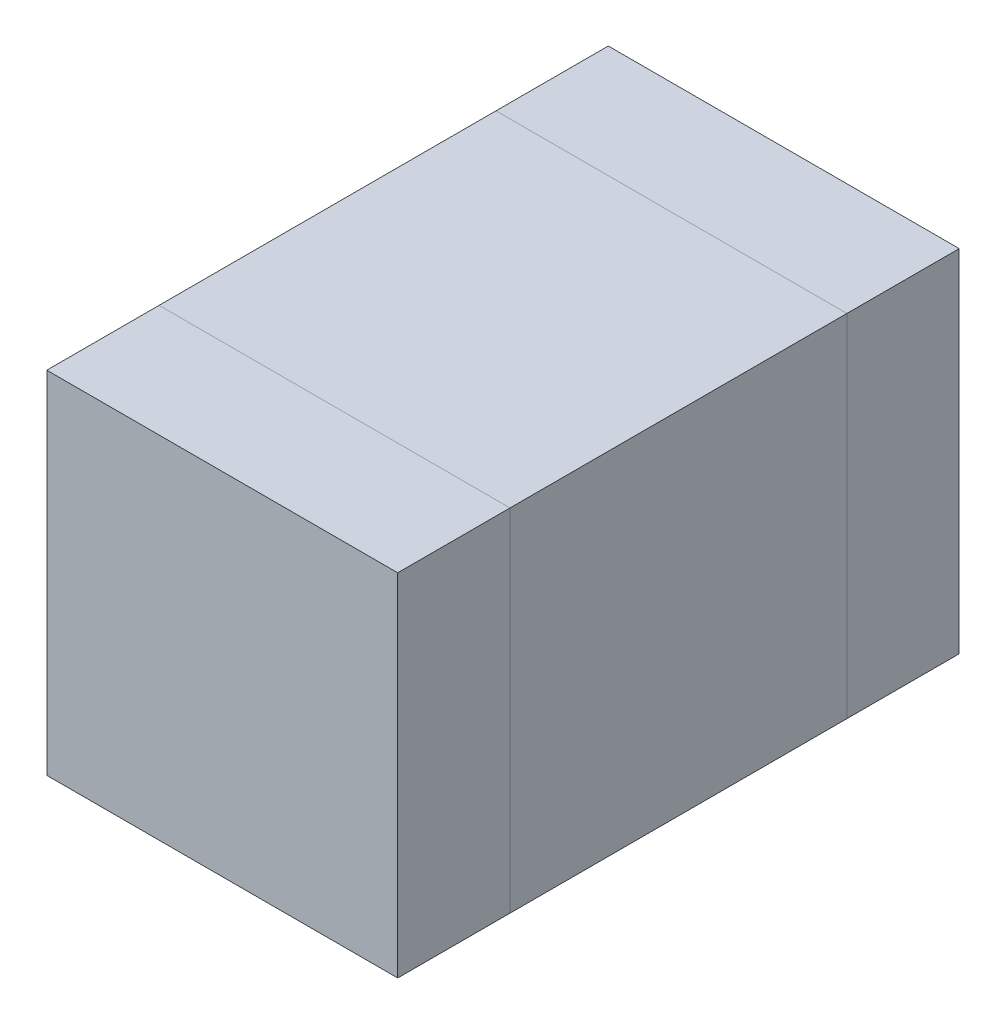
ISO-10303-21;
HEADER;
FILE_DESCRIPTION(('STEP AP214'),'2;1');
FILE_NAME('part.step','',(''),(''),'','','');
FILE_SCHEMA(('AUTOMOTIVE_DESIGN { 1 0 10303 214 1 1 1 1 }'));
ENDSEC;
DATA;
#1=APPLICATION_CONTEXT('core data for automotive mechanical design processes');
#2=APPLICATION_PROTOCOL_DEFINITION('international standard','automotive_design',2000,#1);
#3=PRODUCT_CONTEXT('',#1,'mechanical');
#4=PRODUCT('Part','Part','',(#3));
#5=PRODUCT_RELATED_PRODUCT_CATEGORY('part','',(#4));
#6=PRODUCT_DEFINITION_FORMATION('','',#4);
#7=PRODUCT_DEFINITION_CONTEXT('part definition',#1,'design');
#8=PRODUCT_DEFINITION('design','',#6,#7);
#9=PRODUCT_DEFINITION_SHAPE('','',#8);
#10=(LENGTH_UNIT() NAMED_UNIT(*) SI_UNIT(.MILLI.,.METRE.));
#11=(NAMED_UNIT(*) PLANE_ANGLE_UNIT() SI_UNIT($,.RADIAN.));
#12=(NAMED_UNIT(*) SI_UNIT($,.STERADIAN.) SOLID_ANGLE_UNIT());
#13=UNCERTAINTY_MEASURE_WITH_UNIT(LENGTH_MEASURE(1.E-05),#10,'distance_accuracy_value','');
#14=(GEOMETRIC_REPRESENTATION_CONTEXT(3) GLOBAL_UNCERTAINTY_ASSIGNED_CONTEXT((#13)) GLOBAL_UNIT_ASSIGNED_CONTEXT((#10,
#11,#12)) REPRESENTATION_CONTEXT('',''));
#15=CARTESIAN_POINT('',(0.,0.,0.));
#16=DIRECTION('',(0.,0.,1.));
#17=DIRECTION('',(1.,0.,0.));
#18=AXIS2_PLACEMENT_3D('',#15,#16,#17);
#19=CARTESIAN_POINT('',(0.,1.25,0.));
#20=DIRECTION('',(0.,1.,0.));
#21=DIRECTION('',(0.,0.,1.));
#22=AXIS2_PLACEMENT_3D('',#19,#20,#21);
#23=PLANE('',#22);
#24=DIRECTION('',(0.,0.,-1.));
#25=VECTOR('',#24,1.);
#26=CARTESIAN_POINT('',(-0.625,1.25,-0.6));
#27=LINE('',#26,#25);
#28=CARTESIAN_POINT('',(-0.625,1.25,-0.6));
#29=VERTEX_POINT('',#28);
#30=CARTESIAN_POINT('',(-0.625,1.25,-1.));
#31=VERTEX_POINT('',#30);
#32=EDGE_CURVE('E51',#29,#31,#27,.T.);
#33=ORIENTED_EDGE('',*,*,#32,.F.);
#34=DIRECTION('',(-1.,0.,0.));
#35=VECTOR('',#34,1.);
#36=CARTESIAN_POINT('',(-0.625,1.25,-0.6));
#37=LINE('',#36,#35);
#38=CARTESIAN_POINT('',(0.625,1.25,-0.6));
#39=VERTEX_POINT('',#38);
#40=EDGE_CURVE('E74',#39,#29,#37,.T.);
#41=ORIENTED_EDGE('',*,*,#40,.F.);
#42=DIRECTION('',(0.,0.,1.));
#43=VECTOR('',#42,1.);
#44=CARTESIAN_POINT('',(0.625,1.25,-0.6));
#45=LINE('',#44,#43);
#46=CARTESIAN_POINT('',(0.625,1.25,-1.));
#47=VERTEX_POINT('',#46);
#48=EDGE_CURVE('E79',#47,#39,#45,.T.);
#49=ORIENTED_EDGE('',*,*,#48,.F.);
#50=DIRECTION('',(1.,0.,0.));
#51=VECTOR('',#50,1.);
#52=CARTESIAN_POINT('',(-0.625,1.25,-1.));
#53=LINE('',#52,#51);
#54=EDGE_CURVE('E94',#31,#47,#53,.T.);
#55=ORIENTED_EDGE('',*,*,#54,.F.);
#56=EDGE_LOOP('',(#33,#41,#49,#55));
#57=FACE_BOUND('',#56,.T.);
#58=ADVANCED_FACE('F43',(#57),#23,.T.);
#59=CARTESIAN_POINT('',(0.,0.,0.));
#60=DIRECTION('',(0.,-1.,0.));
#61=DIRECTION('',(0.,0.,-1.));
#62=AXIS2_PLACEMENT_3D('',#59,#60,#61);
#63=PLANE('',#62);
#64=DIRECTION('',(0.,0.,-1.));
#65=VECTOR('',#64,1.);
#66=CARTESIAN_POINT('',(-0.625,0.,-0.6));
#67=LINE('',#66,#65);
#68=CARTESIAN_POINT('',(-0.625,0.,-0.6));
#69=VERTEX_POINT('',#68);
#70=CARTESIAN_POINT('',(-0.625,0.,-1.));
#71=VERTEX_POINT('',#70);
#72=EDGE_CURVE('E103',#69,#71,#67,.T.);
#73=ORIENTED_EDGE('',*,*,#72,.T.);
#74=DIRECTION('',(1.,0.,0.));
#75=VECTOR('',#74,1.);
#76=CARTESIAN_POINT('',(-0.625,0.,-1.));
#77=LINE('',#76,#75);
#78=CARTESIAN_POINT('',(0.625,0.,-1.));
#79=VERTEX_POINT('',#78);
#80=EDGE_CURVE('E92',#71,#79,#77,.T.);
#81=ORIENTED_EDGE('',*,*,#80,.T.);
#82=DIRECTION('',(0.,0.,1.));
#83=VECTOR('',#82,1.);
#84=CARTESIAN_POINT('',(0.625,0.,-0.6));
#85=LINE('',#84,#83);
#86=CARTESIAN_POINT('',(0.625,0.,-0.6));
#87=VERTEX_POINT('',#86);
#88=EDGE_CURVE('E95',#79,#87,#85,.T.);
#89=ORIENTED_EDGE('',*,*,#88,.T.);
#90=DIRECTION('',(-1.,0.,0.));
#91=VECTOR('',#90,1.);
#92=CARTESIAN_POINT('',(-0.625,0.,-0.6));
#93=LINE('',#92,#91);
#94=EDGE_CURVE('E100',#87,#69,#93,.T.);
#95=ORIENTED_EDGE('',*,*,#94,.T.);
#96=EDGE_LOOP('',(#73,#81,#89,#95));
#97=FACE_BOUND('',#96,.T.);
#98=ADVANCED_FACE('F102',(#97),#63,.T.);
#99=CARTESIAN_POINT('',(-0.625,2.56244047484067,-1.));
#100=DIRECTION('',(0.,0.,-1.));
#101=DIRECTION('',(-1.,0.,0.));
#102=AXIS2_PLACEMENT_3D('',#99,#100,#101);
#103=PLANE('',#102);
#104=DIRECTION('',(0.,-1.,0.));
#105=VECTOR('',#104,1.);
#106=CARTESIAN_POINT('',(-0.625,2.56244047484067,-1.));
#107=LINE('',#106,#105);
#108=EDGE_CURVE('E12',#31,#71,#107,.T.);
#109=ORIENTED_EDGE('',*,*,#108,.F.);
#110=ORIENTED_EDGE('',*,*,#54,.T.);
#111=DIRECTION('',(0.,-1.,0.));
#112=VECTOR('',#111,1.);
#113=CARTESIAN_POINT('',(0.625,2.56244047484067,-1.));
#114=LINE('',#113,#112);
#115=EDGE_CURVE('E89',#47,#79,#114,.T.);
#116=ORIENTED_EDGE('',*,*,#115,.T.);
#117=ORIENTED_EDGE('',*,*,#80,.F.);
#118=EDGE_LOOP('',(#109,#110,#116,#117));
#119=FACE_BOUND('',#118,.T.);
#120=ADVANCED_FACE('F90',(#119),#103,.T.);
#121=CARTESIAN_POINT('',(0.625,2.56244047484067,-0.6));
#122=DIRECTION('',(1.,0.,0.));
#123=DIRECTION('',(0.,0.,-1.));
#124=AXIS2_PLACEMENT_3D('',#121,#122,#123);
#125=PLANE('',#124);
#126=ORIENTED_EDGE('',*,*,#115,.F.);
#127=ORIENTED_EDGE('',*,*,#48,.T.);
#128=DIRECTION('',(0.,-1.,0.));
#129=VECTOR('',#128,1.);
#130=CARTESIAN_POINT('',(0.625,2.56244047484067,-0.6));
#131=LINE('',#130,#129);
#132=EDGE_CURVE('E84',#39,#87,#131,.T.);
#133=ORIENTED_EDGE('',*,*,#132,.T.);
#134=ORIENTED_EDGE('',*,*,#88,.F.);
#135=EDGE_LOOP('',(#126,#127,#133,#134));
#136=FACE_BOUND('',#135,.T.);
#137=ADVANCED_FACE('F96',(#136),#125,.T.);
#138=CARTESIAN_POINT('',(-0.625,2.56244047484067,-0.6));
#139=DIRECTION('',(0.,0.,1.));
#140=DIRECTION('',(1.,0.,0.));
#141=AXIS2_PLACEMENT_3D('',#138,#139,#140);
#142=PLANE('',#141);
#143=ORIENTED_EDGE('',*,*,#132,.F.);
#144=ORIENTED_EDGE('',*,*,#40,.T.);
#145=DIRECTION('',(0.,-1.,0.));
#146=VECTOR('',#145,1.);
#147=CARTESIAN_POINT('',(-0.625,2.56244047484067,-0.6));
#148=LINE('',#147,#146);
#149=EDGE_CURVE('E110',#29,#69,#148,.T.);
#150=ORIENTED_EDGE('',*,*,#149,.T.);
#151=ORIENTED_EDGE('',*,*,#94,.F.);
#152=EDGE_LOOP('',(#143,#144,#150,#151));
#153=FACE_BOUND('',#152,.T.);
#154=ADVANCED_FACE('F116',(#153),#142,.T.);
#155=CARTESIAN_POINT('',(-0.625,2.56244047484067,-0.6));
#156=DIRECTION('',(-1.,0.,0.));
#157=DIRECTION('',(0.,0.,1.));
#158=AXIS2_PLACEMENT_3D('',#155,#156,#157);
#159=PLANE('',#158);
#160=ORIENTED_EDGE('',*,*,#149,.F.);
#161=ORIENTED_EDGE('',*,*,#32,.T.);
#162=ORIENTED_EDGE('',*,*,#108,.T.);
#163=ORIENTED_EDGE('',*,*,#72,.F.);
#164=EDGE_LOOP('',(#160,#161,#162,#163));
#165=FACE_BOUND('',#164,.T.);
#166=ADVANCED_FACE('F117',(#165),#159,.T.);
#167=CLOSED_SHELL('',(#58,#98,#120,#137,#154,#166));
#168=MANIFOLD_SOLID_BREP('B2',#167);
#169=CARTESIAN_POINT('',(0.,1.25,0.));
#170=DIRECTION('',(0.,1.,0.));
#171=DIRECTION('',(0.,0.,1.));
#172=AXIS2_PLACEMENT_3D('',#169,#170,#171);
#173=PLANE('',#172);
#174=DIRECTION('',(0.,0.,-1.));
#175=VECTOR('',#174,1.);
#176=CARTESIAN_POINT('',(-0.625,1.25,0.6));
#177=LINE('',#176,#175);
#178=CARTESIAN_POINT('',(-0.625,1.25,1.));
#179=VERTEX_POINT('',#178);
#180=CARTESIAN_POINT('',(-0.625,1.25,0.6));
#181=VERTEX_POINT('',#180);
#182=EDGE_CURVE('E183',#179,#181,#177,.T.);
#183=ORIENTED_EDGE('',*,*,#182,.F.);
#184=DIRECTION('',(-1.,0.,0.));
#185=VECTOR('',#184,1.);
#186=CARTESIAN_POINT('',(-0.625,1.25,1.));
#187=LINE('',#186,#185);
#188=CARTESIAN_POINT('',(0.625,1.25,1.));
#189=VERTEX_POINT('',#188);
#190=EDGE_CURVE('E206',#189,#179,#187,.T.);
#191=ORIENTED_EDGE('',*,*,#190,.F.);
#192=DIRECTION('',(0.,0.,1.));
#193=VECTOR('',#192,1.);
#194=CARTESIAN_POINT('',(0.625,1.25,0.6));
#195=LINE('',#194,#193);
#196=CARTESIAN_POINT('',(0.625,1.25,0.6));
#197=VERTEX_POINT('',#196);
#198=EDGE_CURVE('E211',#197,#189,#195,.T.);
#199=ORIENTED_EDGE('',*,*,#198,.F.);
#200=DIRECTION('',(1.,0.,0.));
#201=VECTOR('',#200,1.);
#202=CARTESIAN_POINT('',(-0.625,1.25,0.6));
#203=LINE('',#202,#201);
#204=EDGE_CURVE('E226',#181,#197,#203,.T.);
#205=ORIENTED_EDGE('',*,*,#204,.F.);
#206=EDGE_LOOP('',(#183,#191,#199,#205));
#207=FACE_BOUND('',#206,.T.);
#208=ADVANCED_FACE('F175',(#207),#173,.T.);
#209=CARTESIAN_POINT('',(0.,0.,0.));
#210=DIRECTION('',(0.,1.,0.));
#211=DIRECTION('',(0.,0.,1.));
#212=AXIS2_PLACEMENT_3D('',#209,#210,#211);
#213=PLANE('',#212);
#214=DIRECTION('',(0.,0.,-1.));
#215=VECTOR('',#214,1.);
#216=CARTESIAN_POINT('',(-0.625,0.,0.6));
#217=LINE('',#216,#215);
#218=CARTESIAN_POINT('',(-0.625,0.,1.));
#219=VERTEX_POINT('',#218);
#220=CARTESIAN_POINT('',(-0.625,0.,0.6));
#221=VERTEX_POINT('',#220);
#222=EDGE_CURVE('E235',#219,#221,#217,.T.);
#223=ORIENTED_EDGE('',*,*,#222,.T.);
#224=DIRECTION('',(1.,0.,0.));
#225=VECTOR('',#224,1.);
#226=CARTESIAN_POINT('',(-0.625,0.,0.6));
#227=LINE('',#226,#225);
#228=CARTESIAN_POINT('',(0.625,0.,0.6));
#229=VERTEX_POINT('',#228);
#230=EDGE_CURVE('E224',#221,#229,#227,.T.);
#231=ORIENTED_EDGE('',*,*,#230,.T.);
#232=DIRECTION('',(0.,0.,1.));
#233=VECTOR('',#232,1.);
#234=CARTESIAN_POINT('',(0.625,0.,0.6));
#235=LINE('',#234,#233);
#236=CARTESIAN_POINT('',(0.625,0.,1.));
#237=VERTEX_POINT('',#236);
#238=EDGE_CURVE('E227',#229,#237,#235,.T.);
#239=ORIENTED_EDGE('',*,*,#238,.T.);
#240=DIRECTION('',(-1.,0.,0.));
#241=VECTOR('',#240,1.);
#242=CARTESIAN_POINT('',(-0.625,0.,1.));
#243=LINE('',#242,#241);
#244=EDGE_CURVE('E232',#237,#219,#243,.T.);
#245=ORIENTED_EDGE('',*,*,#244,.T.);
#246=EDGE_LOOP('',(#223,#231,#239,#245));
#247=FACE_BOUND('',#246,.T.);
#248=ADVANCED_FACE('F234',(#247),#213,.F.);
#249=CARTESIAN_POINT('',(-0.625,2.56244047484067,0.6));
#250=DIRECTION('',(0.,0.,-1.));
#251=DIRECTION('',(-1.,0.,0.));
#252=AXIS2_PLACEMENT_3D('',#249,#250,#251);
#253=PLANE('',#252);
#254=DIRECTION('',(0.,-1.,0.));
#255=VECTOR('',#254,1.);
#256=CARTESIAN_POINT('',(-0.625,2.56244047484067,0.6));
#257=LINE('',#256,#255);
#258=EDGE_CURVE('E41',#181,#221,#257,.T.);
#259=ORIENTED_EDGE('',*,*,#258,.F.);
#260=ORIENTED_EDGE('',*,*,#204,.T.);
#261=DIRECTION('',(0.,-1.,0.));
#262=VECTOR('',#261,1.);
#263=CARTESIAN_POINT('',(0.625,2.56244047484067,0.6));
#264=LINE('',#263,#262);
#265=EDGE_CURVE('E221',#197,#229,#264,.T.);
#266=ORIENTED_EDGE('',*,*,#265,.T.);
#267=ORIENTED_EDGE('',*,*,#230,.F.);
#268=EDGE_LOOP('',(#259,#260,#266,#267));
#269=FACE_BOUND('',#268,.T.);
#270=ADVANCED_FACE('F222',(#269),#253,.T.);
#271=CARTESIAN_POINT('',(0.625,2.56244047484067,0.6));
#272=DIRECTION('',(1.,0.,0.));
#273=DIRECTION('',(0.,0.,-1.));
#274=AXIS2_PLACEMENT_3D('',#271,#272,#273);
#275=PLANE('',#274);
#276=ORIENTED_EDGE('',*,*,#265,.F.);
#277=ORIENTED_EDGE('',*,*,#198,.T.);
#278=DIRECTION('',(0.,-1.,0.));
#279=VECTOR('',#278,1.);
#280=CARTESIAN_POINT('',(0.625,2.56244047484067,1.));
#281=LINE('',#280,#279);
#282=EDGE_CURVE('E216',#189,#237,#281,.T.);
#283=ORIENTED_EDGE('',*,*,#282,.T.);
#284=ORIENTED_EDGE('',*,*,#238,.F.);
#285=EDGE_LOOP('',(#276,#277,#283,#284));
#286=FACE_BOUND('',#285,.T.);
#287=ADVANCED_FACE('F228',(#286),#275,.T.);
#288=CARTESIAN_POINT('',(-0.625,2.56244047484067,1.));
#289=DIRECTION('',(0.,0.,1.));
#290=DIRECTION('',(1.,0.,0.));
#291=AXIS2_PLACEMENT_3D('',#288,#289,#290);
#292=PLANE('',#291);
#293=ORIENTED_EDGE('',*,*,#282,.F.);
#294=ORIENTED_EDGE('',*,*,#190,.T.);
#295=DIRECTION('',(0.,-1.,0.));
#296=VECTOR('',#295,1.);
#297=CARTESIAN_POINT('',(-0.625,2.56244047484067,1.));
#298=LINE('',#297,#296);
#299=EDGE_CURVE('E242',#179,#219,#298,.T.);
#300=ORIENTED_EDGE('',*,*,#299,.T.);
#301=ORIENTED_EDGE('',*,*,#244,.F.);
#302=EDGE_LOOP('',(#293,#294,#300,#301));
#303=FACE_BOUND('',#302,.T.);
#304=ADVANCED_FACE('F248',(#303),#292,.T.);
#305=CARTESIAN_POINT('',(-0.625,2.56244047484067,0.6));
#306=DIRECTION('',(-1.,0.,0.));
#307=DIRECTION('',(0.,0.,1.));
#308=AXIS2_PLACEMENT_3D('',#305,#306,#307);
#309=PLANE('',#308);
#310=ORIENTED_EDGE('',*,*,#299,.F.);
#311=ORIENTED_EDGE('',*,*,#182,.T.);
#312=ORIENTED_EDGE('',*,*,#258,.T.);
#313=ORIENTED_EDGE('',*,*,#222,.F.);
#314=EDGE_LOOP('',(#310,#311,#312,#313));
#315=FACE_BOUND('',#314,.T.);
#316=ADVANCED_FACE('F249',(#315),#309,.T.);
#317=CLOSED_SHELL('',(#208,#248,#270,#287,#304,#316));
#318=MANIFOLD_SOLID_BREP('B6',#317);
#319=CARTESIAN_POINT('',(0.625,1.25,-0.6));
#320=DIRECTION('',(-1.,0.,0.));
#321=DIRECTION('',(0.,0.,1.));
#322=AXIS2_PLACEMENT_3D('',#319,#320,#321);
#323=PLANE('',#322);
#324=DIRECTION('',(0.,0.,-1.));
#325=VECTOR('',#324,1.);
#326=CARTESIAN_POINT('',(0.625,0.,-0.6));
#327=LINE('',#326,#325);
#328=CARTESIAN_POINT('',(0.625,0.,0.6));
#329=VERTEX_POINT('',#328);
#330=CARTESIAN_POINT('',(0.625,0.,-0.6));
#331=VERTEX_POINT('',#330);
#332=EDGE_CURVE('E361',#329,#331,#327,.T.);
#333=ORIENTED_EDGE('',*,*,#332,.T.);
#334=DIRECTION('',(0.,-1.,0.));
#335=VECTOR('',#334,1.);
#336=CARTESIAN_POINT('',(0.625,1.25,-0.6));
#337=LINE('',#336,#335);
#338=CARTESIAN_POINT('',(0.625,1.25,-0.6));
#339=VERTEX_POINT('',#338);
#340=EDGE_CURVE('E173',#339,#331,#337,.T.);
#341=ORIENTED_EDGE('',*,*,#340,.F.);
#342=DIRECTION('',(0.,0.,-1.));
#343=VECTOR('',#342,1.);
#344=CARTESIAN_POINT('',(0.625,1.25,-0.6));
#345=LINE('',#344,#343);
#346=CARTESIAN_POINT('',(0.625,1.25,0.6));
#347=VERTEX_POINT('',#346);
#348=EDGE_CURVE('E349',#347,#339,#345,.T.);
#349=ORIENTED_EDGE('',*,*,#348,.F.);
#350=DIRECTION('',(0.,-1.,0.));
#351=VECTOR('',#350,1.);
#352=CARTESIAN_POINT('',(0.625,1.25,0.6));
#353=LINE('',#352,#351);
#354=EDGE_CURVE('E357',#347,#329,#353,.T.);
#355=ORIENTED_EDGE('',*,*,#354,.T.);
#356=EDGE_LOOP('',(#333,#341,#349,#355));
#357=FACE_BOUND('',#356,.T.);
#358=ADVANCED_FACE('F298',(#357),#323,.F.);
#359=CARTESIAN_POINT('',(-0.625,1.25,-0.6));
#360=DIRECTION('',(0.,0.,1.));
#361=DIRECTION('',(1.,0.,0.));
#362=AXIS2_PLACEMENT_3D('',#359,#360,#361);
#363=PLANE('',#362);
#364=DIRECTION('',(-1.,0.,0.));
#365=VECTOR('',#364,1.);
#366=CARTESIAN_POINT('',(-0.625,0.,-0.6));
#367=LINE('',#366,#365);
#368=CARTESIAN_POINT('',(-0.625,0.,-0.6));
#369=VERTEX_POINT('',#368);
#370=EDGE_CURVE('E353',#331,#369,#367,.T.);
#371=ORIENTED_EDGE('',*,*,#370,.T.);
#372=DIRECTION('',(0.,-1.,0.));
#373=VECTOR('',#372,1.);
#374=CARTESIAN_POINT('',(-0.625,1.25,-0.6));
#375=LINE('',#374,#373);
#376=CARTESIAN_POINT('',(-0.625,1.25,-0.6));
#377=VERTEX_POINT('',#376);
#378=EDGE_CURVE('E306',#377,#369,#375,.T.);
#379=ORIENTED_EDGE('',*,*,#378,.F.);
#380=DIRECTION('',(-1.,0.,0.));
#381=VECTOR('',#380,1.);
#382=CARTESIAN_POINT('',(-0.625,1.25,-0.6));
#383=LINE('',#382,#381);
#384=EDGE_CURVE('E344',#339,#377,#383,.T.);
#385=ORIENTED_EDGE('',*,*,#384,.F.);
#386=ORIENTED_EDGE('',*,*,#340,.T.);
#387=EDGE_LOOP('',(#371,#379,#385,#386));
#388=FACE_BOUND('',#387,.T.);
#389=ADVANCED_FACE('F352',(#388),#363,.F.);
#390=CARTESIAN_POINT('',(-0.625,1.25,-0.6));
#391=DIRECTION('',(1.,0.,0.));
#392=DIRECTION('',(0.,0.,-1.));
#393=AXIS2_PLACEMENT_3D('',#390,#391,#392);
#394=PLANE('',#393);
#395=DIRECTION('',(0.,0.,1.));
#396=VECTOR('',#395,1.);
#397=CARTESIAN_POINT('',(-0.625,0.,-0.6));
#398=LINE('',#397,#396);
#399=CARTESIAN_POINT('',(-0.625,0.,0.6));
#400=VERTEX_POINT('',#399);
#401=EDGE_CURVE('E331',#369,#400,#398,.T.);
#402=ORIENTED_EDGE('',*,*,#401,.T.);
#403=DIRECTION('',(0.,-1.,0.));
#404=VECTOR('',#403,1.);
#405=CARTESIAN_POINT('',(-0.625,1.25,0.6));
#406=LINE('',#405,#404);
#407=CARTESIAN_POINT('',(-0.625,1.25,0.6));
#408=VERTEX_POINT('',#407);
#409=EDGE_CURVE('E354',#408,#400,#406,.T.);
#410=ORIENTED_EDGE('',*,*,#409,.F.);
#411=DIRECTION('',(0.,0.,1.));
#412=VECTOR('',#411,1.);
#413=CARTESIAN_POINT('',(-0.625,1.25,-0.6));
#414=LINE('',#413,#412);
#415=EDGE_CURVE('E347',#377,#408,#414,.T.);
#416=ORIENTED_EDGE('',*,*,#415,.F.);
#417=ORIENTED_EDGE('',*,*,#378,.T.);
#418=EDGE_LOOP('',(#402,#410,#416,#417));
#419=FACE_BOUND('',#418,.T.);
#420=ADVANCED_FACE('F355',(#419),#394,.F.);
#421=CARTESIAN_POINT('',(-0.625,1.25,0.6));
#422=DIRECTION('',(0.,0.,-1.));
#423=DIRECTION('',(-1.,0.,0.));
#424=AXIS2_PLACEMENT_3D('',#421,#422,#423);
#425=PLANE('',#424);
#426=DIRECTION('',(1.,0.,0.));
#427=VECTOR('',#426,1.);
#428=CARTESIAN_POINT('',(-0.625,0.,0.6));
#429=LINE('',#428,#427);
#430=EDGE_CURVE('E337',#400,#329,#429,.T.);
#431=ORIENTED_EDGE('',*,*,#430,.T.);
#432=ORIENTED_EDGE('',*,*,#354,.F.);
#433=DIRECTION('',(1.,0.,0.));
#434=VECTOR('',#433,1.);
#435=CARTESIAN_POINT('',(-0.625,1.25,0.6));
#436=LINE('',#435,#434);
#437=EDGE_CURVE('E314',#408,#347,#436,.T.);
#438=ORIENTED_EDGE('',*,*,#437,.F.);
#439=ORIENTED_EDGE('',*,*,#409,.T.);
#440=EDGE_LOOP('',(#431,#432,#438,#439));
#441=FACE_BOUND('',#440,.T.);
#442=ADVANCED_FACE('F368',(#441),#425,.F.);
#443=CARTESIAN_POINT('',(0.,1.25,0.));
#444=DIRECTION('',(0.,1.,0.));
#445=DIRECTION('',(0.,0.,1.));
#446=AXIS2_PLACEMENT_3D('',#443,#444,#445);
#447=PLANE('',#446);
#448=ORIENTED_EDGE('',*,*,#348,.T.);
#449=ORIENTED_EDGE('',*,*,#384,.T.);
#450=ORIENTED_EDGE('',*,*,#415,.T.);
#451=ORIENTED_EDGE('',*,*,#437,.T.);
#452=EDGE_LOOP('',(#448,#449,#450,#451));
#453=FACE_BOUND('',#452,.T.);
#454=ADVANCED_FACE('F345',(#453),#447,.T.);
#455=CARTESIAN_POINT('',(0.,0.,0.));
#456=DIRECTION('',(0.,1.,0.));
#457=DIRECTION('',(0.,0.,1.));
#458=AXIS2_PLACEMENT_3D('',#455,#456,#457);
#459=PLANE('',#458);
#460=ORIENTED_EDGE('',*,*,#332,.F.);
#461=ORIENTED_EDGE('',*,*,#430,.F.);
#462=ORIENTED_EDGE('',*,*,#401,.F.);
#463=ORIENTED_EDGE('',*,*,#370,.F.);
#464=EDGE_LOOP('',(#460,#461,#462,#463));
#465=FACE_BOUND('',#464,.T.);
#466=ADVANCED_FACE('F371',(#465),#459,.F.);
#467=CLOSED_SHELL('',(#358,#389,#420,#442,#454,#466));
#468=MANIFOLD_SOLID_BREP('B35',#467);
#469=ADVANCED_BREP_SHAPE_REPRESENTATION('',(#18,#168,#318,#468),#14);
#470=SHAPE_DEFINITION_REPRESENTATION(#9,#469);
ENDSEC;
END-ISO-10303-21;
